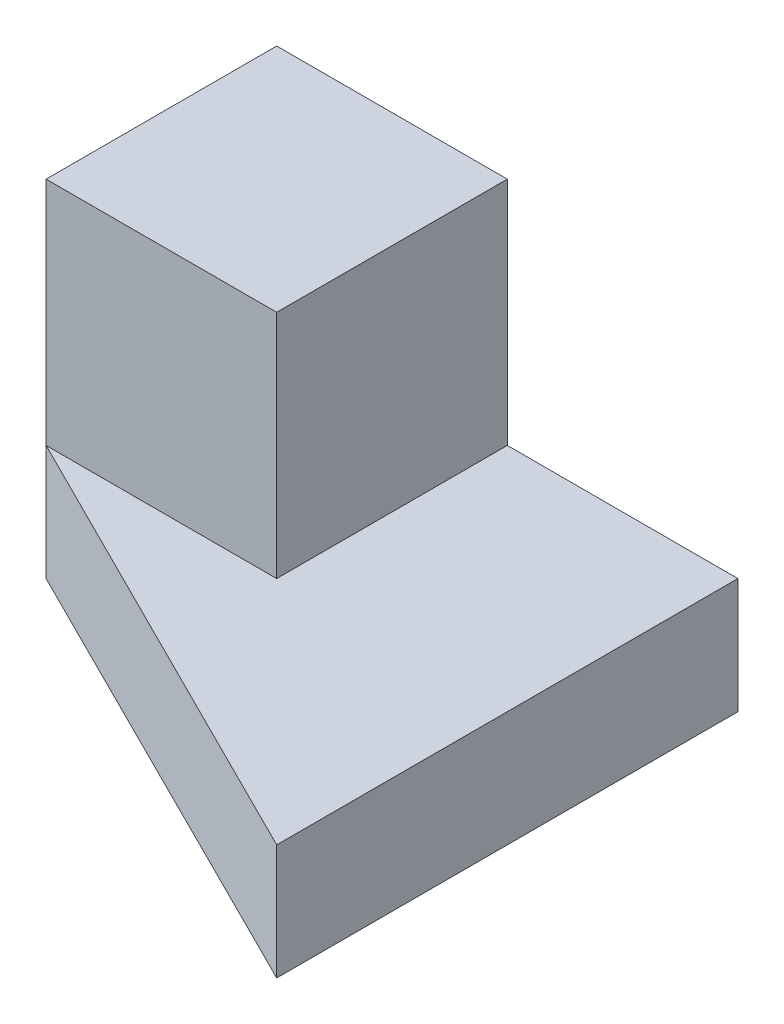
ISO-10303-21;
HEADER;
FILE_DESCRIPTION(('STEP AP214'),'2;1');
FILE_NAME('part.step','',(''),(''),'','','');
FILE_SCHEMA(('AUTOMOTIVE_DESIGN { 1 0 10303 214 1 1 1 1 }'));
ENDSEC;
DATA;
#1=APPLICATION_CONTEXT('core data for automotive mechanical design processes');
#2=APPLICATION_PROTOCOL_DEFINITION('international standard','automotive_design',2000,#1);
#3=PRODUCT_CONTEXT('',#1,'mechanical');
#4=PRODUCT('Part','Part','',(#3));
#5=PRODUCT_RELATED_PRODUCT_CATEGORY('part','',(#4));
#6=PRODUCT_DEFINITION_FORMATION('','',#4);
#7=PRODUCT_DEFINITION_CONTEXT('part definition',#1,'design');
#8=PRODUCT_DEFINITION('design','',#6,#7);
#9=PRODUCT_DEFINITION_SHAPE('','',#8);
#10=(LENGTH_UNIT() NAMED_UNIT(*) SI_UNIT(.MILLI.,.METRE.));
#11=(NAMED_UNIT(*) PLANE_ANGLE_UNIT() SI_UNIT($,.RADIAN.));
#12=(NAMED_UNIT(*) SI_UNIT($,.STERADIAN.) SOLID_ANGLE_UNIT());
#13=UNCERTAINTY_MEASURE_WITH_UNIT(LENGTH_MEASURE(1.E-05),#10,'distance_accuracy_value','');
#14=(GEOMETRIC_REPRESENTATION_CONTEXT(3) GLOBAL_UNCERTAINTY_ASSIGNED_CONTEXT((#13)) GLOBAL_UNIT_ASSIGNED_CONTEXT((#10,
#11,#12)) REPRESENTATION_CONTEXT('',''));
#15=CARTESIAN_POINT('',(0.,0.,0.));
#16=DIRECTION('',(0.,0.,1.));
#17=DIRECTION('',(1.,0.,0.));
#18=AXIS2_PLACEMENT_3D('',#15,#16,#17);
#19=CARTESIAN_POINT('',(-40.,10.,-20.));
#20=DIRECTION('',(0.447213595499958,0.,-0.894427190999916));
#21=DIRECTION('',(-0.894427190999916,0.,-0.447213595499958));
#22=AXIS2_PLACEMENT_3D('',#19,#20,#21);
#23=PLANE('',#22);
#24=DIRECTION('',(0.894427190999916,0.,0.447213595499958));
#25=VECTOR('',#24,1.);
#26=CARTESIAN_POINT('',(-40.,0.,-20.));
#27=LINE('',#26,#25);
#28=CARTESIAN_POINT('',(-40.,0.,-20.));
#29=VERTEX_POINT('',#28);
#30=CARTESIAN_POINT('',(0.,0.,0.));
#31=VERTEX_POINT('',#30);
#32=EDGE_CURVE('E121',#29,#31,#27,.T.);
#33=ORIENTED_EDGE('',*,*,#32,.T.);
#34=DIRECTION('',(0.,-1.,0.));
#35=VECTOR('',#34,1.);
#36=CARTESIAN_POINT('',(0.,10.,0.));
#37=LINE('',#36,#35);
#38=CARTESIAN_POINT('',(0.,10.,0.));
#39=VERTEX_POINT('',#38);
#40=EDGE_CURVE('E11',#39,#31,#37,.T.);
#41=ORIENTED_EDGE('',*,*,#40,.F.);
#42=DIRECTION('',(0.894427190999916,0.,0.447213595499958));
#43=VECTOR('',#42,1.);
#44=CARTESIAN_POINT('',(-40.,10.,-20.));
#45=LINE('',#44,#43);
#46=CARTESIAN_POINT('',(-40.,10.,-20.));
#47=VERTEX_POINT('',#46);
#48=EDGE_CURVE('E130',#47,#39,#45,.T.);
#49=ORIENTED_EDGE('',*,*,#48,.F.);
#50=DIRECTION('',(0.,-1.,0.));
#51=VECTOR('',#50,1.);
#52=CARTESIAN_POINT('',(-40.,10.,-20.));
#53=LINE('',#52,#51);
#54=EDGE_CURVE('E119',#47,#29,#53,.T.);
#55=ORIENTED_EDGE('',*,*,#54,.T.);
#56=EDGE_LOOP('',(#33,#41,#49,#55));
#57=FACE_BOUND('',#56,.T.);
#58=ADVANCED_FACE('F36',(#57),#23,.F.);
#59=CARTESIAN_POINT('',(0.,10.,0.));
#60=DIRECTION('',(-1.,0.,0.));
#61=DIRECTION('',(0.,0.,1.));
#62=AXIS2_PLACEMENT_3D('',#59,#60,#61);
#63=PLANE('',#62);
#64=DIRECTION('',(0.,0.,-1.));
#65=VECTOR('',#64,1.);
#66=CARTESIAN_POINT('',(0.,0.,0.));
#67=LINE('',#66,#65);
#68=CARTESIAN_POINT('',(0.,0.,-40.));
#69=VERTEX_POINT('',#68);
#70=EDGE_CURVE('E124',#31,#69,#67,.T.);
#71=ORIENTED_EDGE('',*,*,#70,.T.);
#72=DIRECTION('',(0.,-1.,0.));
#73=VECTOR('',#72,1.);
#74=CARTESIAN_POINT('',(0.,10.,-40.));
#75=LINE('',#74,#73);
#76=CARTESIAN_POINT('',(0.,10.,-40.));
#77=VERTEX_POINT('',#76);
#78=EDGE_CURVE('E43',#77,#69,#75,.T.);
#79=ORIENTED_EDGE('',*,*,#78,.F.);
#80=DIRECTION('',(0.,0.,-1.));
#81=VECTOR('',#80,1.);
#82=CARTESIAN_POINT('',(0.,10.,0.));
#83=LINE('',#82,#81);
#84=EDGE_CURVE('E82',#39,#77,#83,.T.);
#85=ORIENTED_EDGE('',*,*,#84,.F.);
#86=ORIENTED_EDGE('',*,*,#40,.T.);
#87=EDGE_LOOP('',(#71,#79,#85,#86));
#88=FACE_BOUND('',#87,.T.);
#89=ADVANCED_FACE('F161',(#88),#63,.F.);
#90=CARTESIAN_POINT('',(0.,10.,-40.));
#91=DIRECTION('',(0.,0.,1.));
#92=DIRECTION('',(1.,0.,0.));
#93=AXIS2_PLACEMENT_3D('',#90,#91,#92);
#94=PLANE('',#93);
#95=DIRECTION('',(-1.,0.,0.));
#96=VECTOR('',#95,1.);
#97=CARTESIAN_POINT('',(0.,0.,-40.));
#98=LINE('',#97,#96);
#99=CARTESIAN_POINT('',(-40.,0.,-40.));
#100=VERTEX_POINT('',#99);
#101=EDGE_CURVE('E135',#69,#100,#98,.T.);
#102=ORIENTED_EDGE('',*,*,#101,.T.);
#103=DIRECTION('',(0.,-1.,0.));
#104=VECTOR('',#103,1.);
#105=CARTESIAN_POINT('',(-40.,10.,-40.));
#106=LINE('',#105,#104);
#107=CARTESIAN_POINT('',(-40.,30.,-40.));
#108=VERTEX_POINT('',#107);
#109=EDGE_CURVE('E139',#108,#100,#106,.T.);
#110=ORIENTED_EDGE('',*,*,#109,.F.);
#111=DIRECTION('',(-1.,0.,0.));
#112=VECTOR('',#111,1.);
#113=CARTESIAN_POINT('',(-40.,30.,-40.));
#114=LINE('',#113,#112);
#115=CARTESIAN_POINT('',(-20.,30.,-40.));
#116=VERTEX_POINT('',#115);
#117=EDGE_CURVE('E115',#116,#108,#114,.T.);
#118=ORIENTED_EDGE('',*,*,#117,.F.);
#119=DIRECTION('',(0.,-1.,0.));
#120=VECTOR('',#119,1.);
#121=CARTESIAN_POINT('',(-20.,30.,-40.));
#122=LINE('',#121,#120);
#123=CARTESIAN_POINT('',(-20.,10.,-40.));
#124=VERTEX_POINT('',#123);
#125=EDGE_CURVE('E126',#116,#124,#122,.T.);
#126=ORIENTED_EDGE('',*,*,#125,.T.);
#127=DIRECTION('',(-1.,0.,0.));
#128=VECTOR('',#127,1.);
#129=CARTESIAN_POINT('',(0.,10.,-40.));
#130=LINE('',#129,#128);
#131=EDGE_CURVE('E50',#77,#124,#130,.T.);
#132=ORIENTED_EDGE('',*,*,#131,.F.);
#133=ORIENTED_EDGE('',*,*,#78,.T.);
#134=EDGE_LOOP('',(#102,#110,#118,#126,#132,#133));
#135=FACE_BOUND('',#134,.T.);
#136=ADVANCED_FACE('F143',(#135),#94,.F.);
#137=CARTESIAN_POINT('',(-40.,10.,-40.));
#138=DIRECTION('',(1.,0.,0.));
#139=DIRECTION('',(0.,0.,-1.));
#140=AXIS2_PLACEMENT_3D('',#137,#138,#139);
#141=PLANE('',#140);
#142=DIRECTION('',(0.,0.,1.));
#143=VECTOR('',#142,1.);
#144=CARTESIAN_POINT('',(-40.,0.,-40.));
#145=LINE('',#144,#143);
#146=EDGE_CURVE('E77',#100,#29,#145,.T.);
#147=ORIENTED_EDGE('',*,*,#146,.T.);
#148=ORIENTED_EDGE('',*,*,#54,.F.);
#149=DIRECTION('',(0.,-1.,0.));
#150=VECTOR('',#149,1.);
#151=CARTESIAN_POINT('',(-40.,30.,-20.));
#152=LINE('',#151,#150);
#153=CARTESIAN_POINT('',(-40.,30.,-20.));
#154=VERTEX_POINT('',#153);
#155=EDGE_CURVE('E103',#154,#47,#152,.T.);
#156=ORIENTED_EDGE('',*,*,#155,.F.);
#157=DIRECTION('',(0.,0.,1.));
#158=VECTOR('',#157,1.);
#159=CARTESIAN_POINT('',(-40.,30.,-40.));
#160=LINE('',#159,#158);
#161=EDGE_CURVE('E109',#108,#154,#160,.T.);
#162=ORIENTED_EDGE('',*,*,#161,.F.);
#163=ORIENTED_EDGE('',*,*,#109,.T.);
#164=EDGE_LOOP('',(#147,#148,#156,#162,#163));
#165=FACE_BOUND('',#164,.T.);
#166=ADVANCED_FACE('F118',(#165),#141,.F.);
#167=CARTESIAN_POINT('',(0.,10.,0.));
#168=DIRECTION('',(0.,1.,0.));
#169=DIRECTION('',(0.,0.,1.));
#170=AXIS2_PLACEMENT_3D('',#167,#168,#169);
#171=PLANE('',#170);
#172=DIRECTION('',(0.,0.,-1.));
#173=VECTOR('',#172,1.);
#174=CARTESIAN_POINT('',(-20.,10.,-40.));
#175=LINE('',#174,#173);
#176=CARTESIAN_POINT('',(-20.,10.,-20.));
#177=VERTEX_POINT('',#176);
#178=EDGE_CURVE('E116',#177,#124,#175,.T.);
#179=ORIENTED_EDGE('',*,*,#178,.F.);
#180=DIRECTION('',(1.,0.,0.));
#181=VECTOR('',#180,1.);
#182=CARTESIAN_POINT('',(-40.,10.,-20.));
#183=LINE('',#182,#181);
#184=EDGE_CURVE('E57',#47,#177,#183,.T.);
#185=ORIENTED_EDGE('',*,*,#184,.F.);
#186=ORIENTED_EDGE('',*,*,#48,.T.);
#187=ORIENTED_EDGE('',*,*,#84,.T.);
#188=ORIENTED_EDGE('',*,*,#131,.T.);
#189=EDGE_LOOP('',(#179,#185,#186,#187,#188));
#190=FACE_BOUND('',#189,.T.);
#191=ADVANCED_FACE('F150',(#190),#171,.T.);
#192=CARTESIAN_POINT('',(0.,0.,0.));
#193=DIRECTION('',(0.,1.,0.));
#194=DIRECTION('',(0.,0.,1.));
#195=AXIS2_PLACEMENT_3D('',#192,#193,#194);
#196=PLANE('',#195);
#197=ORIENTED_EDGE('',*,*,#32,.F.);
#198=ORIENTED_EDGE('',*,*,#146,.F.);
#199=ORIENTED_EDGE('',*,*,#101,.F.);
#200=ORIENTED_EDGE('',*,*,#70,.F.);
#201=EDGE_LOOP('',(#197,#198,#199,#200));
#202=FACE_BOUND('',#201,.T.);
#203=ADVANCED_FACE('F147',(#202),#196,.F.);
#204=CARTESIAN_POINT('',(-40.,30.,-20.));
#205=DIRECTION('',(0.,0.,-1.));
#206=DIRECTION('',(-1.,0.,0.));
#207=AXIS2_PLACEMENT_3D('',#204,#205,#206);
#208=PLANE('',#207);
#209=ORIENTED_EDGE('',*,*,#184,.T.);
#210=DIRECTION('',(0.,-1.,0.));
#211=VECTOR('',#210,1.);
#212=CARTESIAN_POINT('',(-20.,30.,-20.));
#213=LINE('',#212,#211);
#214=CARTESIAN_POINT('',(-20.,30.,-20.));
#215=VERTEX_POINT('',#214);
#216=EDGE_CURVE('E105',#215,#177,#213,.T.);
#217=ORIENTED_EDGE('',*,*,#216,.F.);
#218=DIRECTION('',(1.,0.,0.));
#219=VECTOR('',#218,1.);
#220=CARTESIAN_POINT('',(-40.,30.,-20.));
#221=LINE('',#220,#219);
#222=EDGE_CURVE('E99',#154,#215,#221,.T.);
#223=ORIENTED_EDGE('',*,*,#222,.F.);
#224=ORIENTED_EDGE('',*,*,#155,.T.);
#225=EDGE_LOOP('',(#209,#217,#223,#224));
#226=FACE_BOUND('',#225,.T.);
#227=ADVANCED_FACE('F101',(#226),#208,.F.);
#228=CARTESIAN_POINT('',(-20.,30.,-40.));
#229=DIRECTION('',(-1.,0.,0.));
#230=DIRECTION('',(0.,0.,1.));
#231=AXIS2_PLACEMENT_3D('',#228,#229,#230);
#232=PLANE('',#231);
#233=ORIENTED_EDGE('',*,*,#178,.T.);
#234=ORIENTED_EDGE('',*,*,#125,.F.);
#235=DIRECTION('',(0.,0.,-1.));
#236=VECTOR('',#235,1.);
#237=CARTESIAN_POINT('',(-20.,30.,-40.));
#238=LINE('',#237,#236);
#239=EDGE_CURVE('E108',#215,#116,#238,.T.);
#240=ORIENTED_EDGE('',*,*,#239,.F.);
#241=ORIENTED_EDGE('',*,*,#216,.T.);
#242=EDGE_LOOP('',(#233,#234,#240,#241));
#243=FACE_BOUND('',#242,.T.);
#244=ADVANCED_FACE('F190',(#243),#232,.F.);
#245=CARTESIAN_POINT('',(0.,30.,0.));
#246=DIRECTION('',(0.,1.,0.));
#247=DIRECTION('',(0.,0.,1.));
#248=AXIS2_PLACEMENT_3D('',#245,#246,#247);
#249=PLANE('',#248);
#250=ORIENTED_EDGE('',*,*,#161,.T.);
#251=ORIENTED_EDGE('',*,*,#222,.T.);
#252=ORIENTED_EDGE('',*,*,#239,.T.);
#253=ORIENTED_EDGE('',*,*,#117,.T.);
#254=EDGE_LOOP('',(#250,#251,#252,#253));
#255=FACE_BOUND('',#254,.T.);
#256=ADVANCED_FACE('F113',(#255),#249,.T.);
#257=CLOSED_SHELL('',(#58,#89,#136,#166,#191,#203,#227,#244,#256));
#258=MANIFOLD_SOLID_BREP('B2',#257);
#259=ADVANCED_BREP_SHAPE_REPRESENTATION('',(#18,#258),#14);
#260=SHAPE_DEFINITION_REPRESENTATION(#9,#259);
ENDSEC;
END-ISO-10303-21;
